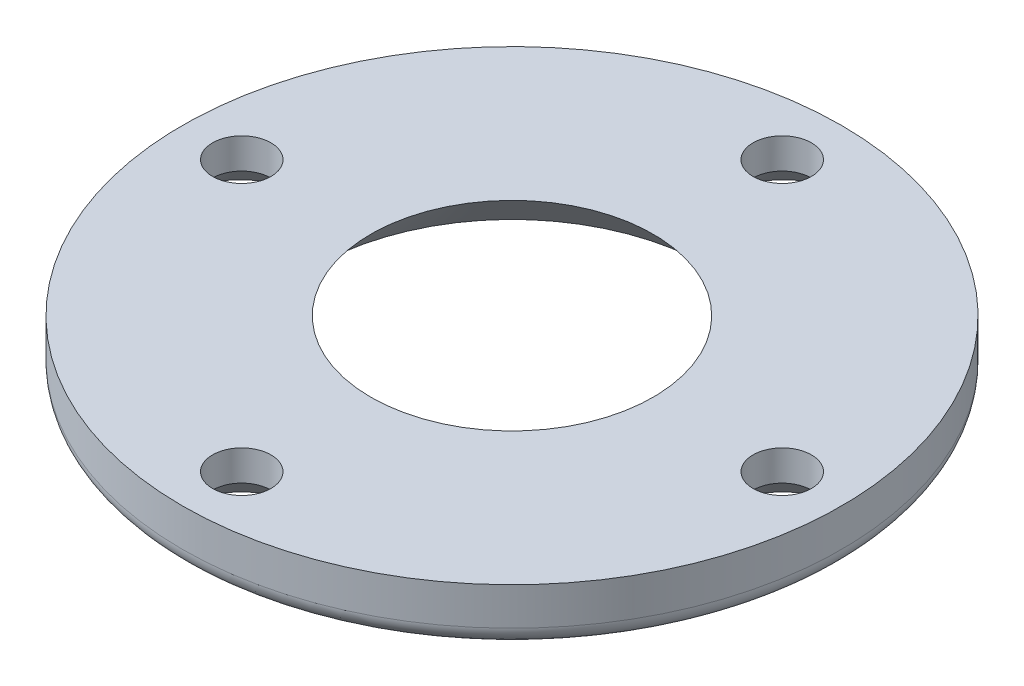
ISO-10303-21;
HEADER;
FILE_DESCRIPTION(('STEP AP214'),'2;1');
FILE_NAME('part.step','',(''),(''),'','','');
FILE_SCHEMA(('AUTOMOTIVE_DESIGN { 1 0 10303 214 1 1 1 1 }'));
ENDSEC;
DATA;
#1=APPLICATION_CONTEXT('core data for automotive mechanical design processes');
#2=APPLICATION_PROTOCOL_DEFINITION('international standard','automotive_design',2000,#1);
#3=PRODUCT_CONTEXT('',#1,'mechanical');
#4=PRODUCT('Part','Part','',(#3));
#5=PRODUCT_RELATED_PRODUCT_CATEGORY('part','',(#4));
#6=PRODUCT_DEFINITION_FORMATION('','',#4);
#7=PRODUCT_DEFINITION_CONTEXT('part definition',#1,'design');
#8=PRODUCT_DEFINITION('design','',#6,#7);
#9=PRODUCT_DEFINITION_SHAPE('','',#8);
#10=(LENGTH_UNIT() NAMED_UNIT(*) SI_UNIT(.MILLI.,.METRE.));
#11=(NAMED_UNIT(*) PLANE_ANGLE_UNIT() SI_UNIT($,.RADIAN.));
#12=(NAMED_UNIT(*) SI_UNIT($,.STERADIAN.) SOLID_ANGLE_UNIT());
#13=UNCERTAINTY_MEASURE_WITH_UNIT(LENGTH_MEASURE(1.E-05),#10,'distance_accuracy_value','');
#14=(GEOMETRIC_REPRESENTATION_CONTEXT(3) GLOBAL_UNCERTAINTY_ASSIGNED_CONTEXT((#13)) GLOBAL_UNIT_ASSIGNED_CONTEXT((#10,
#11,#12)) REPRESENTATION_CONTEXT('',''));
#15=CARTESIAN_POINT('',(0.,0.,0.));
#16=DIRECTION('',(0.,0.,1.));
#17=DIRECTION('',(1.,0.,0.));
#18=AXIS2_PLACEMENT_3D('',#15,#16,#17);
#19=CARTESIAN_POINT('',(0.,3.,0.));
#20=DIRECTION('',(0.,1.,0.));
#21=DIRECTION('',(0.,0.,1.));
#22=AXIS2_PLACEMENT_3D('',#19,#20,#21);
#23=PLANE('',#22);
#24=CARTESIAN_POINT('',(14.35,3.,0.));
#25=DIRECTION('',(0.,1.,0.));
#26=DIRECTION('',(1.,0.,0.));
#27=AXIS2_PLACEMENT_3D('',#24,#25,#26);
#28=CIRCLE('',#27,1.55);
#29=CARTESIAN_POINT('',(15.9,3.,0.));
#30=VERTEX_POINT('',#29);
#31=EDGE_CURVE('E107',#30,#30,#28,.T.);
#32=ORIENTED_EDGE('',*,*,#31,.F.);
#33=EDGE_LOOP('',(#32));
#34=FACE_BOUND('',#33,.T.);
#35=CARTESIAN_POINT('',(0.,3.,-14.35));
#36=DIRECTION('',(0.,1.,0.));
#37=DIRECTION('',(0.,0.,-1.));
#38=AXIS2_PLACEMENT_3D('',#35,#36,#37);
#39=CIRCLE('',#38,1.55);
#40=CARTESIAN_POINT('',(0.,3.,-15.9));
#41=VERTEX_POINT('',#40);
#42=EDGE_CURVE('E223',#41,#41,#39,.T.);
#43=ORIENTED_EDGE('',*,*,#42,.F.);
#44=EDGE_LOOP('',(#43));
#45=FACE_BOUND('',#44,.T.);
#46=CARTESIAN_POINT('',(-14.35,3.,1.50308271637197E-13));
#47=DIRECTION('',(0.,1.,0.));
#48=DIRECTION('',(-1.,0.,0.));
#49=AXIS2_PLACEMENT_3D('',#46,#47,#48);
#50=CIRCLE('',#49,1.55);
#51=CARTESIAN_POINT('',(-15.9,3.,1.66543659862817E-13));
#52=VERTEX_POINT('',#51);
#53=EDGE_CURVE('E231',#52,#52,#50,.T.);
#54=ORIENTED_EDGE('',*,*,#53,.F.);
#55=EDGE_LOOP('',(#54));
#56=FACE_BOUND('',#55,.T.);
#57=CARTESIAN_POINT('',(0.,3.,14.35));
#58=DIRECTION('',(0.,1.,0.));
#59=DIRECTION('',(0.,0.,1.));
#60=AXIS2_PLACEMENT_3D('',#57,#58,#59);
#61=CIRCLE('',#60,1.55);
#62=CARTESIAN_POINT('',(0.,3.,15.9));
#63=VERTEX_POINT('',#62);
#64=EDGE_CURVE('E245',#63,#63,#61,.T.);
#65=ORIENTED_EDGE('',*,*,#64,.F.);
#66=EDGE_LOOP('',(#65));
#67=FACE_BOUND('',#66,.T.);
#68=CARTESIAN_POINT('',(0.,3.,0.));
#69=DIRECTION('',(0.,1.,0.));
#70=DIRECTION('',(0.,0.,1.));
#71=AXIS2_PLACEMENT_3D('',#68,#69,#70);
#72=CIRCLE('',#71,17.5);
#73=CARTESIAN_POINT('',(0.,3.,17.5));
#74=VERTEX_POINT('',#73);
#75=EDGE_CURVE('E251',#74,#74,#72,.T.);
#76=ORIENTED_EDGE('',*,*,#75,.T.);
#77=EDGE_LOOP('',(#76));
#78=FACE_BOUND('',#77,.T.);
#79=CARTESIAN_POINT('',(0.,3.,0.));
#80=DIRECTION('',(0.,1.,0.));
#81=DIRECTION('',(0.,0.,1.));
#82=AXIS2_PLACEMENT_3D('',#79,#80,#81);
#83=CIRCLE('',#82,7.5);
#84=CARTESIAN_POINT('',(0.,3.,7.5));
#85=VERTEX_POINT('',#84);
#86=EDGE_CURVE('E196',#85,#85,#83,.T.);
#87=ORIENTED_EDGE('',*,*,#86,.F.);
#88=EDGE_LOOP('',(#87));
#89=FACE_BOUND('',#88,.T.);
#90=ADVANCED_FACE('F43',(#34,#45,#56,#67,#78,#89),#23,.T.);
#91=CARTESIAN_POINT('',(0.,0.,0.));
#92=DIRECTION('',(0.,1.,0.));
#93=DIRECTION('',(0.,0.,1.));
#94=AXIS2_PLACEMENT_3D('',#91,#92,#93);
#95=PLANE('',#94);
#96=CARTESIAN_POINT('',(0.,0.,0.));
#97=DIRECTION('',(0.,1.,0.));
#98=DIRECTION('',(0.,0.,1.));
#99=AXIS2_PLACEMENT_3D('',#96,#97,#98);
#100=CIRCLE('',#99,10.5);
#101=CARTESIAN_POINT('',(0.,0.,10.5));
#102=VERTEX_POINT('',#101);
#103=EDGE_CURVE('E199',#102,#102,#100,.T.);
#104=ORIENTED_EDGE('',*,*,#103,.T.);
#105=EDGE_LOOP('',(#104));
#106=FACE_BOUND('',#105,.T.);
#107=CARTESIAN_POINT('',(-14.35,0.,1.50308271637197E-13));
#108=DIRECTION('',(0.,1.,0.));
#109=DIRECTION('',(-1.,0.,0.));
#110=AXIS2_PLACEMENT_3D('',#107,#108,#109);
#111=CIRCLE('',#110,2.93000000000001);
#112=CARTESIAN_POINT('',(-16.3619372822299,0.,2.13002543937247));
#113=VERTEX_POINT('',#112);
#114=CARTESIAN_POINT('',(-16.36193728223,0.,-2.13002543937213));
#115=VERTEX_POINT('',#114);
#116=EDGE_CURVE('E219',#113,#115,#111,.T.);
#117=ORIENTED_EDGE('',*,*,#116,.T.);
#118=CARTESIAN_POINT('',(0.,0.,0.));
#119=DIRECTION('',(0.,1.,0.));
#120=DIRECTION('',(0.,0.,1.));
#121=AXIS2_PLACEMENT_3D('',#118,#119,#120);
#122=CIRCLE('',#121,16.5);
#123=CARTESIAN_POINT('',(-2.1300254393723,0.,-16.36193728223));
#124=VERTEX_POINT('',#123);
#125=EDGE_CURVE('E100',#115,#124,#122,.F.);
#126=ORIENTED_EDGE('',*,*,#125,.T.);
#127=CARTESIAN_POINT('',(0.,0.,-14.35));
#128=DIRECTION('',(0.,1.,0.));
#129=DIRECTION('',(0.,0.,-1.));
#130=AXIS2_PLACEMENT_3D('',#127,#128,#129);
#131=CIRCLE('',#130,2.93000000000001);
#132=CARTESIAN_POINT('',(2.1300254393723,0.,-16.36193728223));
#133=VERTEX_POINT('',#132);
#134=EDGE_CURVE('E96',#124,#133,#131,.T.);
#135=ORIENTED_EDGE('',*,*,#134,.T.);
#136=CARTESIAN_POINT('',(0.,0.,0.));
#137=DIRECTION('',(0.,1.,0.));
#138=DIRECTION('',(0.,0.,1.));
#139=AXIS2_PLACEMENT_3D('',#136,#137,#138);
#140=CIRCLE('',#139,16.5);
#141=CARTESIAN_POINT('',(16.36193728223,0.,-2.13002543937235));
#142=VERTEX_POINT('',#141);
#143=EDGE_CURVE('E89',#133,#142,#140,.F.);
#144=ORIENTED_EDGE('',*,*,#143,.T.);
#145=CARTESIAN_POINT('',(14.35,0.,0.));
#146=DIRECTION('',(0.,1.,0.));
#147=DIRECTION('',(1.,0.,0.));
#148=AXIS2_PLACEMENT_3D('',#145,#146,#147);
#149=CIRCLE('',#148,2.93000000000001);
#150=CARTESIAN_POINT('',(16.36193728223,0.,2.13002543937224));
#151=VERTEX_POINT('',#150);
#152=EDGE_CURVE('E93',#142,#151,#149,.T.);
#153=ORIENTED_EDGE('',*,*,#152,.T.);
#154=CARTESIAN_POINT('',(0.,0.,0.));
#155=DIRECTION('',(0.,1.,0.));
#156=DIRECTION('',(0.,0.,1.));
#157=AXIS2_PLACEMENT_3D('',#154,#155,#156);
#158=CIRCLE('',#157,16.5);
#159=CARTESIAN_POINT('',(2.1300254393723,0.,16.36193728223));
#160=VERTEX_POINT('',#159);
#161=EDGE_CURVE('E70',#151,#160,#158,.F.);
#162=ORIENTED_EDGE('',*,*,#161,.T.);
#163=CARTESIAN_POINT('',(0.,0.,14.35));
#164=DIRECTION('',(0.,1.,0.));
#165=DIRECTION('',(0.,0.,1.));
#166=AXIS2_PLACEMENT_3D('',#163,#164,#165);
#167=CIRCLE('',#166,2.93000000000001);
#168=CARTESIAN_POINT('',(-2.1300254393723,0.,16.36193728223));
#169=VERTEX_POINT('',#168);
#170=EDGE_CURVE('E202',#160,#169,#167,.T.);
#171=ORIENTED_EDGE('',*,*,#170,.T.);
#172=CARTESIAN_POINT('',(0.,0.,0.));
#173=DIRECTION('',(0.,1.,0.));
#174=DIRECTION('',(0.,0.,1.));
#175=AXIS2_PLACEMENT_3D('',#172,#173,#174);
#176=CIRCLE('',#175,16.5);
#177=EDGE_CURVE('E207',#169,#113,#176,.F.);
#178=ORIENTED_EDGE('',*,*,#177,.T.);
#179=EDGE_LOOP('',(#117,#126,#135,#144,#153,#162,#171,#178));
#180=FACE_BOUND('',#179,.T.);
#181=ADVANCED_FACE('F92',(#106,#180),#95,.F.);
#182=CARTESIAN_POINT('',(0.,3.,0.));
#183=DIRECTION('',(0.,-1.,0.));
#184=DIRECTION('',(0.,0.,-1.));
#185=AXIS2_PLACEMENT_3D('',#182,#183,#184);
#186=CYLINDRICAL_SURFACE('',#185,17.5);
#187=CARTESIAN_POINT('',(0.,1.,0.));
#188=DIRECTION('',(0.,1.,0.));
#189=DIRECTION('',(0.,0.,1.));
#190=AXIS2_PLACEMENT_3D('',#187,#188,#189);
#191=CIRCLE('',#190,17.5);
#192=CARTESIAN_POINT('',(0.,1.,17.5));
#193=VERTEX_POINT('',#192);
#194=EDGE_CURVE('E201',#193,#193,#191,.T.);
#195=ORIENTED_EDGE('',*,*,#194,.T.);
#196=EDGE_LOOP('',(#195));
#197=FACE_BOUND('',#196,.T.);
#198=ORIENTED_EDGE('',*,*,#75,.F.);
#199=EDGE_LOOP('',(#198));
#200=FACE_BOUND('',#199,.T.);
#201=ADVANCED_FACE('F172',(#197,#200),#186,.T.);
#202=CARTESIAN_POINT('',(0.,5.,14.35));
#203=DIRECTION('',(0.,-1.,0.));
#204=DIRECTION('',(0.,0.,-1.));
#205=AXIS2_PLACEMENT_3D('',#202,#203,#204);
#206=CYLINDRICAL_SURFACE('',#205,1.55);
#207=CARTESIAN_POINT('',(0.,1.38000000000001,14.35));
#208=DIRECTION('',(0.,1.,0.));
#209=DIRECTION('',(0.,0.,1.));
#210=AXIS2_PLACEMENT_3D('',#207,#208,#209);
#211=CIRCLE('',#210,1.55);
#212=CARTESIAN_POINT('',(0.,1.38000000000001,15.9));
#213=VERTEX_POINT('',#212);
#214=EDGE_CURVE('E209',#213,#213,#211,.F.);
#215=ORIENTED_EDGE('',*,*,#214,.T.);
#216=EDGE_LOOP('',(#215));
#217=FACE_BOUND('',#216,.T.);
#218=ORIENTED_EDGE('',*,*,#64,.T.);
#219=EDGE_LOOP('',(#218));
#220=FACE_BOUND('',#219,.T.);
#221=ADVANCED_FACE('F169',(#217,#220),#206,.F.);
#222=CARTESIAN_POINT('',(0.,1.38000000000001,14.35));
#223=DIRECTION('',(0.,-1.,0.));
#224=DIRECTION('',(0.,0.,-1.));
#225=AXIS2_PLACEMENT_3D('',#222,#223,#224);
#226=CONICAL_SURFACE('',#225,1.55,0.78539816339745);
#227=ORIENTED_EDGE('',*,*,#170,.F.);
#228=CARTESIAN_POINT('',(2.1300254393723,0.,16.36193728223));
#229=CARTESIAN_POINT('',(2.1006708283794,2.87344197871028E-05,16.3929769351358));
#230=CARTESIAN_POINT('',(2.06992853132094,0.00109203714756216,16.4226111832569));
#231=CARTESIAN_POINT('',(2.00627791638471,0.0047953488135179,16.4791950390313));
#232=CARTESIAN_POINT('',(1.97337515772412,0.00743144206675659,16.506151120588));
#233=CARTESIAN_POINT('',(1.90614087715797,0.0137666222520169,16.5574441243659));
#234=CARTESIAN_POINT('',(1.87182339585444,0.0174567522889738,16.5818008352366));
#235=CARTESIAN_POINT('',(1.80180100066957,0.0255896325122809,16.6283469623081));
#236=CARTESIAN_POINT('',(1.76609492495749,0.0300330238635597,16.6505345065646));
#237=CARTESIAN_POINT('',(1.66388391412313,0.0432395966692672,16.7102192140959));
#238=CARTESIAN_POINT('',(1.59608576823537,0.0525622825613292,16.7453869949139));
#239=CARTESIAN_POINT('',(1.45781087464647,0.0716600385954067,16.8098020724105));
#240=CARTESIAN_POINT('',(1.38733305901709,0.0814352894430963,16.8390469786406));
#241=CARTESIAN_POINT('',(1.24389611421334,0.100688432759219,16.89234569789));
#242=CARTESIAN_POINT('',(1.17092413082206,0.110164058816863,16.9163655792347));
#243=CARTESIAN_POINT('',(1.02339609716383,0.12812292173962,16.9594064415519));
#244=CARTESIAN_POINT('',(0.948839677057427,0.136605923832015,16.9784262412395));
#245=CARTESIAN_POINT('',(0.773231923526417,0.15468460008705,17.0173887504663));
#246=CARTESIAN_POINT('',(0.671706980535431,0.163694189924857,17.0354884960832));
#247=CARTESIAN_POINT('',(0.46730130784447,0.178180276083924,17.0638049325641));
#248=CARTESIAN_POINT('',(0.364420235197101,0.183655860505297,17.0740195889259));
#249=CARTESIAN_POINT('',(0.157982152439849,0.190567989029399,17.0868261074681));
#250=CARTESIAN_POINT('',(0.0544247510865972,0.192001940077398,17.0894130758809));
#251=CARTESIAN_POINT('',(-0.152564695846987,0.190690282602337,17.0870154170996));
#252=CARTESIAN_POINT('',(-0.255996753235584,0.187945104368294,17.0820315694073));
#253=CARTESIAN_POINT('',(-0.46273471253689,0.178497165450119,17.06430684722));
#254=CARTESIAN_POINT('',(-0.566034817600031,0.171767223158434,17.0515126767402));
#255=CARTESIAN_POINT('',(-0.7710529334461,0.154961181941926,17.0177787932982));
#256=CARTESIAN_POINT('',(-0.872770596425065,0.144884357988207,16.9968373152311));
#257=CARTESIAN_POINT('',(-1.07301918575195,0.122469412736061,16.9464054273482));
#258=CARTESIAN_POINT('',(-1.1715679654881,0.110148351116242,16.9169785966402));
#259=CARTESIAN_POINT('',(-1.36522328561087,0.0845547845174734,16.8486189706979));
#260=CARTESIAN_POINT('',(-1.46033103929434,0.0712826199133519,16.8096895643034));
#261=CARTESIAN_POINT('',(-1.60562955309491,0.0512671648943903,16.7400673983246));
#262=CARTESIAN_POINT('',(-1.65753547036073,0.0441723003457841,16.7130403204377));
#263=CARTESIAN_POINT('',(-1.75918854910513,0.030853120453895,16.6551421806775));
#264=CARTESIAN_POINT('',(-1.80893886520717,0.0246275011366057,16.6242770108368));
#265=CARTESIAN_POINT('',(-1.90623636370717,0.0136651411204997,16.5578820536807));
#266=CARTESIAN_POINT('',(-1.95375484760579,0.00894476021436981,16.5223065911224));
#267=CARTESIAN_POINT('',(-2.02221778418615,0.0038255350261,16.4651875384309));
#268=CARTESIAN_POINT('',(-2.0446173949931,0.00244512815133739,16.4454726780044));
#269=CARTESIAN_POINT('',(-2.08825300457404,0.000535244805964703,16.4047154111002));
#270=CARTESIAN_POINT('',(-2.10948775652668,6.66356912813178E-06,16.383671632081));
#271=CARTESIAN_POINT('',(-2.1300254393723,0.,16.36193728223));
#272=B_SPLINE_CURVE_WITH_KNOTS('',3,(#228,#229,#230,#231,#232,#233,#234,#235,#236,#237,#238,
#239,#240,#241,#242,#243,#244,#245,#246,#247,#248,#249,#250,#251,#252,#253,#254,#255,#256,#257,
#258,#259,#260,#261,#262,#263,#264,#265,#266,#267,#268,#269,#270,#271),.UNSPECIFIED.,.F.,.F.,(4,
2,2,2,2,2,2,2,2,2,2,2,2,2,2,2,2,2,2,2,2,4),(0.,0.128010954254938,0.255704529236439,
0.382343734611422,0.50909127967798,0.739557147685854,0.97011584624908,1.20212984532732,
1.4341986092784,1.74435594045875,2.05459327136876,2.36502960089726,2.67543396962724,
2.98798052339353,3.30059482775999,3.61092507296435,3.92114480845388,4.09785469358765,
4.2742965768036,4.4525954779855,4.54215366220222,4.63180590715633),.UNSPECIFIED.);
#273=EDGE_CURVE('E58',#160,#169,#272,.T.);
#274=ORIENTED_EDGE('',*,*,#273,.T.);
#275=EDGE_LOOP('',(#227,#274));
#276=FACE_BOUND('',#275,.T.);
#277=ORIENTED_EDGE('',*,*,#214,.F.);
#278=EDGE_LOOP('',(#277));
#279=FACE_BOUND('',#278,.T.);
#280=ADVANCED_FACE('F167',(#276,#279),#226,.F.);
#281=CARTESIAN_POINT('',(-14.35,5.,1.50308271637197E-13));
#282=DIRECTION('',(0.,-1.,0.));
#283=DIRECTION('',(1.,0.,0.));
#284=AXIS2_PLACEMENT_3D('',#281,#282,#283);
#285=CYLINDRICAL_SURFACE('',#284,1.55);
#286=CARTESIAN_POINT('',(-14.35,1.38000000000001,1.50308271637197E-13));
#287=DIRECTION('',(0.,1.,0.));
#288=DIRECTION('',(-1.,0.,0.));
#289=AXIS2_PLACEMENT_3D('',#286,#287,#288);
#290=CIRCLE('',#289,1.55);
#291=CARTESIAN_POINT('',(-15.9,1.38000000000001,1.66543659862817E-13));
#292=VERTEX_POINT('',#291);
#293=EDGE_CURVE('E224',#292,#292,#290,.F.);
#294=ORIENTED_EDGE('',*,*,#293,.T.);
#295=EDGE_LOOP('',(#294));
#296=FACE_BOUND('',#295,.T.);
#297=ORIENTED_EDGE('',*,*,#53,.T.);
#298=EDGE_LOOP('',(#297));
#299=FACE_BOUND('',#298,.T.);
#300=ADVANCED_FACE('F163',(#296,#299),#285,.F.);
#301=CARTESIAN_POINT('',(-14.35,1.38000000000001,1.50308271637197E-13));
#302=DIRECTION('',(0.,-1.,0.));
#303=DIRECTION('',(1.,0.,0.));
#304=AXIS2_PLACEMENT_3D('',#301,#302,#303);
#305=CONICAL_SURFACE('',#304,1.55,0.78539816339745);
#306=ORIENTED_EDGE('',*,*,#116,.F.);
#307=CARTESIAN_POINT('',(-16.3619372822299,0.,2.13002543937247));
#308=CARTESIAN_POINT('',(-16.3929769351358,2.87344197873833E-05,2.10067082837957));
#309=CARTESIAN_POINT('',(-16.4226111832569,0.00109203714756233,2.06992853132111));
#310=CARTESIAN_POINT('',(-16.4791950390313,0.00479534881351779,2.00627791638488));
#311=CARTESIAN_POINT('',(-16.506151120588,0.00743144206675633,1.97337515772429));
#312=CARTESIAN_POINT('',(-16.5574441243659,0.0137666222520168,1.90614087715814));
#313=CARTESIAN_POINT('',(-16.5818008352366,0.017456752288974,1.87182339585462));
#314=CARTESIAN_POINT('',(-16.628346962308,0.0255896325122814,1.80180100066974));
#315=CARTESIAN_POINT('',(-16.6505345065646,0.0300330238635604,1.76609492495767));
#316=CARTESIAN_POINT('',(-16.7102192140959,0.0432395966692682,1.6638839141233));
#317=CARTESIAN_POINT('',(-16.7453869949139,0.0525622825613302,1.59608576823555));
#318=CARTESIAN_POINT('',(-16.8098020724105,0.0716600385954073,1.45781087464664));
#319=CARTESIAN_POINT('',(-16.8390469786406,0.0814352894430965,1.38733305901726));
#320=CARTESIAN_POINT('',(-16.89234569789,0.100688432759219,1.24389611421352));
#321=CARTESIAN_POINT('',(-16.9163655792346,0.110164058816864,1.17092413082224));
#322=CARTESIAN_POINT('',(-16.9594064415519,0.12812292173962,1.023396097164));
#323=CARTESIAN_POINT('',(-16.9784262412395,0.136605923832014,0.948839677057603));
#324=CARTESIAN_POINT('',(-17.0173887504663,0.154684600087048,0.773231923526594));
#325=CARTESIAN_POINT('',(-17.0354884960832,0.163694189924857,0.671706980535608));
#326=CARTESIAN_POINT('',(-17.0638049325641,0.178180276083925,0.467301307844648));
#327=CARTESIAN_POINT('',(-17.0740195889259,0.183655860505297,0.364420235197278));
#328=CARTESIAN_POINT('',(-17.0868261074681,0.190567989029397,0.157982152440026));
#329=CARTESIAN_POINT('',(-17.0894130758809,0.192001940077396,0.0544247510867744));
#330=CARTESIAN_POINT('',(-17.0870154170996,0.190690282602336,-0.15256469584681));
#331=CARTESIAN_POINT('',(-17.0820315694073,0.187945104368294,-0.255996753235407));
#332=CARTESIAN_POINT('',(-17.06430684722,0.178497165450119,-0.462734712536713));
#333=CARTESIAN_POINT('',(-17.0515126767402,0.171767223158435,-0.566034817599854));
#334=CARTESIAN_POINT('',(-17.0177787932982,0.154961181941926,-0.771052933445923));
#335=CARTESIAN_POINT('',(-16.9968373152311,0.144884357988207,-0.872770596424888));
#336=CARTESIAN_POINT('',(-16.9464054273482,0.122469412736061,-1.07301918575178));
#337=CARTESIAN_POINT('',(-16.9169785966402,0.110148351116242,-1.17156796548793));
#338=CARTESIAN_POINT('',(-16.848618970698,0.084554784517473,-1.3652232856107));
#339=CARTESIAN_POINT('',(-16.8096895643034,0.0712826199133513,-1.46033103929416));
#340=CARTESIAN_POINT('',(-16.7400673983246,0.05126716489439,-1.60562955309474));
#341=CARTESIAN_POINT('',(-16.7130403204377,0.0441723003457841,-1.65753547036056));
#342=CARTESIAN_POINT('',(-16.6551421806775,0.0308531204538952,-1.75918854910495));
#343=CARTESIAN_POINT('',(-16.6242770108368,0.0246275011366059,-1.80893886520699));
#344=CARTESIAN_POINT('',(-16.5578820536807,0.0136651411204999,-1.906236363707));
#345=CARTESIAN_POINT('',(-16.5223065911224,0.00894476021437008,-1.95375484760561));
#346=CARTESIAN_POINT('',(-16.4651875384309,0.00382553502610008,-2.02221778418598));
#347=CARTESIAN_POINT('',(-16.4454726780044,0.00244512815133737,-2.04461739499293));
#348=CARTESIAN_POINT('',(-16.4047154111003,0.000535244805964524,-2.08825300457386));
#349=CARTESIAN_POINT('',(-16.383671632081,6.6635691279316E-06,-2.10948775652651));
#350=CARTESIAN_POINT('',(-16.36193728223,0.,-2.13002543937213));
#351=B_SPLINE_CURVE_WITH_KNOTS('',3,(#307,#308,#309,#310,#311,#312,#313,#314,#315,#316,#317,
#318,#319,#320,#321,#322,#323,#324,#325,#326,#327,#328,#329,#330,#331,#332,#333,#334,#335,#336,
#337,#338,#339,#340,#341,#342,#343,#344,#345,#346,#347,#348,#349,#350),.UNSPECIFIED.,.F.,.F.,(4,
2,2,2,2,2,2,2,2,2,2,2,2,2,2,2,2,2,2,2,2,4),(0.,0.128010954254938,0.255704529236441,
0.382343734611423,0.50909127967798,0.739557147685856,0.970115846249081,1.20212984532732,
1.4341986092784,1.74435594045876,2.05459327136876,2.36502960089726,2.67543396962724,
2.98798052339354,3.30059482775999,3.61092507296436,3.92114480845388,4.09785469358765,
4.2742965768036,4.4525954779855,4.54215366220222,4.63180590715633),.UNSPECIFIED.);
#352=EDGE_CURVE('E11',#113,#115,#351,.T.);
#353=ORIENTED_EDGE('',*,*,#352,.T.);
#354=EDGE_LOOP('',(#306,#353));
#355=FACE_BOUND('',#354,.T.);
#356=ORIENTED_EDGE('',*,*,#293,.F.);
#357=EDGE_LOOP('',(#356));
#358=FACE_BOUND('',#357,.T.);
#359=ADVANCED_FACE('F155',(#355,#358),#305,.F.);
#360=CARTESIAN_POINT('',(0.,5.,-14.35));
#361=DIRECTION('',(0.,-1.,0.));
#362=DIRECTION('',(0.,0.,1.));
#363=AXIS2_PLACEMENT_3D('',#360,#361,#362);
#364=CYLINDRICAL_SURFACE('',#363,1.55);
#365=CARTESIAN_POINT('',(0.,1.38000000000001,-14.35));
#366=DIRECTION('',(0.,1.,0.));
#367=DIRECTION('',(0.,0.,-1.));
#368=AXIS2_PLACEMENT_3D('',#365,#366,#367);
#369=CIRCLE('',#368,1.55);
#370=CARTESIAN_POINT('',(0.,1.38000000000001,-15.9));
#371=VERTEX_POINT('',#370);
#372=EDGE_CURVE('E108',#371,#371,#369,.F.);
#373=ORIENTED_EDGE('',*,*,#372,.T.);
#374=EDGE_LOOP('',(#373));
#375=FACE_BOUND('',#374,.T.);
#376=ORIENTED_EDGE('',*,*,#42,.T.);
#377=EDGE_LOOP('',(#376));
#378=FACE_BOUND('',#377,.T.);
#379=ADVANCED_FACE('F152',(#375,#378),#364,.F.);
#380=CARTESIAN_POINT('',(0.,1.38000000000001,-14.35));
#381=DIRECTION('',(0.,-1.,0.));
#382=DIRECTION('',(0.,0.,1.));
#383=AXIS2_PLACEMENT_3D('',#380,#381,#382);
#384=CONICAL_SURFACE('',#383,1.55,0.78539816339745);
#385=ORIENTED_EDGE('',*,*,#134,.F.);
#386=CARTESIAN_POINT('',(-2.1300254393723,0.,-16.36193728223));
#387=CARTESIAN_POINT('',(-2.1006708283794,2.87344197871028E-05,-16.3929769351358));
#388=CARTESIAN_POINT('',(-2.06992853132094,0.00109203714756216,-16.4226111832569));
#389=CARTESIAN_POINT('',(-2.00627791638471,0.0047953488135179,-16.4791950390313));
#390=CARTESIAN_POINT('',(-1.97337515772412,0.00743144206675659,-16.506151120588));
#391=CARTESIAN_POINT('',(-1.90614087715797,0.0137666222520169,-16.5574441243659));
#392=CARTESIAN_POINT('',(-1.87182339585444,0.0174567522889738,-16.5818008352366));
#393=CARTESIAN_POINT('',(-1.80180100066957,0.0255896325122809,-16.6283469623081));
#394=CARTESIAN_POINT('',(-1.76609492495749,0.0300330238635597,-16.6505345065646));
#395=CARTESIAN_POINT('',(-1.66388391412313,0.0432395966692672,-16.7102192140959));
#396=CARTESIAN_POINT('',(-1.59608576823537,0.0525622825613292,-16.7453869949139));
#397=CARTESIAN_POINT('',(-1.45781087464647,0.0716600385954067,-16.8098020724105));
#398=CARTESIAN_POINT('',(-1.38733305901709,0.0814352894430963,-16.8390469786406));
#399=CARTESIAN_POINT('',(-1.24389611421334,0.100688432759219,-16.89234569789));
#400=CARTESIAN_POINT('',(-1.17092413082206,0.110164058816863,-16.9163655792347));
#401=CARTESIAN_POINT('',(-1.02339609716383,0.12812292173962,-16.9594064415519));
#402=CARTESIAN_POINT('',(-0.948839677057427,0.136605923832015,-16.9784262412395));
#403=CARTESIAN_POINT('',(-0.773231923526417,0.15468460008705,-17.0173887504663));
#404=CARTESIAN_POINT('',(-0.671706980535431,0.163694189924857,-17.0354884960832));
#405=CARTESIAN_POINT('',(-0.46730130784447,0.178180276083924,-17.0638049325641));
#406=CARTESIAN_POINT('',(-0.364420235197101,0.183655860505297,-17.0740195889259));
#407=CARTESIAN_POINT('',(-0.157982152439849,0.190567989029399,-17.0868261074681));
#408=CARTESIAN_POINT('',(-0.0544247510865972,0.192001940077398,-17.0894130758809));
#409=CARTESIAN_POINT('',(0.152564695846987,0.190690282602337,-17.0870154170996));
#410=CARTESIAN_POINT('',(0.255996753235584,0.187945104368294,-17.0820315694073));
#411=CARTESIAN_POINT('',(0.46273471253689,0.178497165450119,-17.06430684722));
#412=CARTESIAN_POINT('',(0.566034817600031,0.171767223158434,-17.0515126767402));
#413=CARTESIAN_POINT('',(0.7710529334461,0.154961181941926,-17.0177787932982));
#414=CARTESIAN_POINT('',(0.872770596425065,0.144884357988207,-16.9968373152311));
#415=CARTESIAN_POINT('',(1.07301918575195,0.122469412736061,-16.9464054273482));
#416=CARTESIAN_POINT('',(1.1715679654881,0.110148351116242,-16.9169785966402));
#417=CARTESIAN_POINT('',(1.36522328561087,0.0845547845174734,-16.8486189706979));
#418=CARTESIAN_POINT('',(1.46033103929434,0.0712826199133519,-16.8096895643034));
#419=CARTESIAN_POINT('',(1.60562955309491,0.0512671648943903,-16.7400673983246));
#420=CARTESIAN_POINT('',(1.65753547036073,0.0441723003457841,-16.7130403204377));
#421=CARTESIAN_POINT('',(1.75918854910513,0.030853120453895,-16.6551421806775));
#422=CARTESIAN_POINT('',(1.80893886520717,0.0246275011366057,-16.6242770108368));
#423=CARTESIAN_POINT('',(1.90623636370717,0.0136651411204997,-16.5578820536807));
#424=CARTESIAN_POINT('',(1.95375484760579,0.00894476021436981,-16.5223065911224));
#425=CARTESIAN_POINT('',(2.02221778418615,0.0038255350261,-16.4651875384309));
#426=CARTESIAN_POINT('',(2.0446173949931,0.00244512815133739,-16.4454726780044));
#427=CARTESIAN_POINT('',(2.08825300457404,0.000535244805964703,-16.4047154111002));
#428=CARTESIAN_POINT('',(2.10948775652668,6.66356912813178E-06,-16.383671632081));
#429=CARTESIAN_POINT('',(2.1300254393723,0.,-16.36193728223));
#430=B_SPLINE_CURVE_WITH_KNOTS('',3,(#386,#387,#388,#389,#390,#391,#392,#393,#394,#395,#396,
#397,#398,#399,#400,#401,#402,#403,#404,#405,#406,#407,#408,#409,#410,#411,#412,#413,#414,#415,
#416,#417,#418,#419,#420,#421,#422,#423,#424,#425,#426,#427,#428,#429),.UNSPECIFIED.,.F.,.F.,(4,
2,2,2,2,2,2,2,2,2,2,2,2,2,2,2,2,2,2,2,2,4),(0.,0.128010954254938,0.255704529236439,
0.382343734611422,0.50909127967798,0.739557147685854,0.97011584624908,1.20212984532732,
1.4341986092784,1.74435594045875,2.05459327136876,2.36502960089726,2.67543396962724,
2.98798052339353,3.30059482775999,3.61092507296435,3.92114480845388,4.09785469358765,
4.2742965768036,4.4525954779855,4.54215366220222,4.63180590715633),.UNSPECIFIED.);
#431=EDGE_CURVE('E112',#124,#133,#430,.T.);
#432=ORIENTED_EDGE('',*,*,#431,.T.);
#433=EDGE_LOOP('',(#385,#432));
#434=FACE_BOUND('',#433,.T.);
#435=ORIENTED_EDGE('',*,*,#372,.F.);
#436=EDGE_LOOP('',(#435));
#437=FACE_BOUND('',#436,.T.);
#438=ADVANCED_FACE('F144',(#434,#437),#384,.F.);
#439=CARTESIAN_POINT('',(14.35,5.,0.));
#440=DIRECTION('',(0.,-1.,0.));
#441=DIRECTION('',(-1.,0.,0.));
#442=AXIS2_PLACEMENT_3D('',#439,#440,#441);
#443=CYLINDRICAL_SURFACE('',#442,1.55);
#444=CARTESIAN_POINT('',(14.35,1.38000000000001,0.));
#445=DIRECTION('',(0.,1.,0.));
#446=DIRECTION('',(1.,0.,0.));
#447=AXIS2_PLACEMENT_3D('',#444,#445,#446);
#448=CIRCLE('',#447,1.55);
#449=CARTESIAN_POINT('',(15.9,1.38000000000001,0.));
#450=VERTEX_POINT('',#449);
#451=EDGE_CURVE('E234',#450,#450,#448,.F.);
#452=ORIENTED_EDGE('',*,*,#451,.T.);
#453=EDGE_LOOP('',(#452));
#454=FACE_BOUND('',#453,.T.);
#455=ORIENTED_EDGE('',*,*,#31,.T.);
#456=EDGE_LOOP('',(#455));
#457=FACE_BOUND('',#456,.T.);
#458=ADVANCED_FACE('F142',(#454,#457),#443,.F.);
#459=CARTESIAN_POINT('',(14.35,1.38000000000001,0.));
#460=DIRECTION('',(0.,-1.,0.));
#461=DIRECTION('',(-1.,0.,0.));
#462=AXIS2_PLACEMENT_3D('',#459,#460,#461);
#463=CONICAL_SURFACE('',#462,1.55,0.78539816339745);
#464=ORIENTED_EDGE('',*,*,#152,.F.);
#465=CARTESIAN_POINT('',(16.36193728223,0.,-2.13002543937235));
#466=CARTESIAN_POINT('',(16.3929769351358,2.87344197875878E-05,-2.10067082837946));
#467=CARTESIAN_POINT('',(16.4226111832569,0.00109203714756256,-2.06992853132099));
#468=CARTESIAN_POINT('',(16.4791950390313,0.00479534881351795,-2.00627791638477));
#469=CARTESIAN_POINT('',(16.506151120588,0.00743144206675641,-1.97337515772418));
#470=CARTESIAN_POINT('',(16.5574441243659,0.0137666222520169,-1.90614087715802));
#471=CARTESIAN_POINT('',(16.5818008352366,0.0174567522889742,-1.8718233958545));
#472=CARTESIAN_POINT('',(16.6283469623081,0.0255896325122816,-1.80180100066962));
#473=CARTESIAN_POINT('',(16.6505345065646,0.0300330238635603,-1.76609492495755));
#474=CARTESIAN_POINT('',(16.7102192140959,0.043239596669268,-1.66388391412318));
#475=CARTESIAN_POINT('',(16.7453869949139,0.0525622825613306,-1.59608576823543));
#476=CARTESIAN_POINT('',(16.8098020724105,0.0716600385954083,-1.45781087464652));
#477=CARTESIAN_POINT('',(16.8390469786406,0.0814352894430974,-1.38733305901714));
#478=CARTESIAN_POINT('',(16.89234569789,0.10068843275922,-1.24389611421339));
#479=CARTESIAN_POINT('',(16.9163655792347,0.110164058816864,-1.17092413082211));
#480=CARTESIAN_POINT('',(16.9594064415519,0.128122921739622,-1.02339609716387));
#481=CARTESIAN_POINT('',(16.9784262412395,0.136605923832016,-0.94883967705747));
#482=CARTESIAN_POINT('',(17.0173887504663,0.15468460008705,-0.773231923526459));
#483=CARTESIAN_POINT('',(17.0354884960832,0.163694189924858,-0.671706980535473));
#484=CARTESIAN_POINT('',(17.0638049325641,0.178180276083924,-0.467301307844512));
#485=CARTESIAN_POINT('',(17.0740195889259,0.183655860505297,-0.364420235197143));
#486=CARTESIAN_POINT('',(17.0868261074681,0.190567989029398,-0.15798215243989));
#487=CARTESIAN_POINT('',(17.0894130758809,0.192001940077398,-0.0544247510866383));
#488=CARTESIAN_POINT('',(17.0870154170996,0.190690282602337,0.152564695846946));
#489=CARTESIAN_POINT('',(17.0820315694073,0.187945104368294,0.255996753235543));
#490=CARTESIAN_POINT('',(17.06430684722,0.178497165450118,0.462734712536849));
#491=CARTESIAN_POINT('',(17.0515126767402,0.171767223158433,0.566034817599991));
#492=CARTESIAN_POINT('',(17.0177787932982,0.154961181941923,0.77105293344606));
#493=CARTESIAN_POINT('',(16.9968373152311,0.144884357988204,0.872770596425023));
#494=CARTESIAN_POINT('',(16.9464054273482,0.122469412736058,1.07301918575191));
#495=CARTESIAN_POINT('',(16.9169785966402,0.110148351116239,1.17156796548807));
#496=CARTESIAN_POINT('',(16.8486189706979,0.0845547845174707,1.36522328561083));
#497=CARTESIAN_POINT('',(16.8096895643034,0.0712826199133498,1.46033103929429));
#498=CARTESIAN_POINT('',(16.7400673983246,0.0512671648943881,1.60562955309487));
#499=CARTESIAN_POINT('',(16.7130403204377,0.0441723003457817,1.65753547036069));
#500=CARTESIAN_POINT('',(16.6551421806775,0.0308531204538933,1.75918854910508));
#501=CARTESIAN_POINT('',(16.6242770108368,0.0246275011366048,1.80893886520712));
#502=CARTESIAN_POINT('',(16.5578820536807,0.0136651411204997,1.90623636370712));
#503=CARTESIAN_POINT('',(16.5223065911224,0.00894476021436981,1.95375484760573));
#504=CARTESIAN_POINT('',(16.4651875384309,0.0038255350260999,2.0222177841861));
#505=CARTESIAN_POINT('',(16.4454726780044,0.00244512815133723,2.04461739499304));
#506=CARTESIAN_POINT('',(16.4047154111002,0.000535244805964487,2.08825300457398));
#507=CARTESIAN_POINT('',(16.383671632081,6.66356912794088E-06,2.10948775652662));
#508=CARTESIAN_POINT('',(16.36193728223,0.,2.13002543937224));
#509=B_SPLINE_CURVE_WITH_KNOTS('',3,(#465,#466,#467,#468,#469,#470,#471,#472,#473,#474,#475,
#476,#477,#478,#479,#480,#481,#482,#483,#484,#485,#486,#487,#488,#489,#490,#491,#492,#493,#494,
#495,#496,#497,#498,#499,#500,#501,#502,#503,#504,#505,#506,#507,#508),.UNSPECIFIED.,.F.,.F.,(4,
2,2,2,2,2,2,2,2,2,2,2,2,2,2,2,2,2,2,2,2,4),(0.,0.128010954254938,0.255704529236442,
0.382343734611426,0.509091279677983,0.739557147685862,0.970115846249089,1.20212984532733,
1.43419860927842,1.74435594045877,2.05459327136878,2.36502960089728,2.67543396962726,
2.98798052339355,3.30059482776001,3.61092507296438,3.9211448084539,4.09785469358766,
4.27429657680361,4.4525954779855,4.54215366220222,4.63180590715633),.UNSPECIFIED.);
#510=EDGE_CURVE('E105',#142,#151,#509,.T.);
#511=ORIENTED_EDGE('',*,*,#510,.T.);
#512=EDGE_LOOP('',(#464,#511));
#513=FACE_BOUND('',#512,.T.);
#514=ORIENTED_EDGE('',*,*,#451,.F.);
#515=EDGE_LOOP('',(#514));
#516=FACE_BOUND('',#515,.T.);
#517=ADVANCED_FACE('F103',(#513,#516),#463,.F.);
#518=CARTESIAN_POINT('',(0.,0.,0.));
#519=DIRECTION('',(0.,-1.,0.));
#520=DIRECTION('',(0.,0.,-1.));
#521=AXIS2_PLACEMENT_3D('',#518,#519,#520);
#522=CONICAL_SURFACE('',#521,10.5,0.785398163397446);
#523=ORIENTED_EDGE('',*,*,#86,.T.);
#524=EDGE_LOOP('',(#523));
#525=FACE_BOUND('',#524,.T.);
#526=ORIENTED_EDGE('',*,*,#103,.F.);
#527=EDGE_LOOP('',(#526));
#528=FACE_BOUND('',#527,.T.);
#529=ADVANCED_FACE('F141',(#525,#528),#522,.F.);
#530=CARTESIAN_POINT('',(0.,1.,0.));
#531=DIRECTION('',(0.,1.,0.));
#532=DIRECTION('',(0.,0.,1.));
#533=AXIS2_PLACEMENT_3D('',#530,#531,#532);
#534=TOROIDAL_SURFACE('',#533,16.5,1.);
#535=ORIENTED_EDGE('',*,*,#431,.F.);
#536=ORIENTED_EDGE('',*,*,#125,.F.);
#537=ORIENTED_EDGE('',*,*,#352,.F.);
#538=ORIENTED_EDGE('',*,*,#177,.F.);
#539=ORIENTED_EDGE('',*,*,#273,.F.);
#540=ORIENTED_EDGE('',*,*,#161,.F.);
#541=ORIENTED_EDGE('',*,*,#510,.F.);
#542=ORIENTED_EDGE('',*,*,#143,.F.);
#543=EDGE_LOOP('',(#535,#536,#537,#538,#539,#540,#541,#542));
#544=FACE_BOUND('',#543,.T.);
#545=ORIENTED_EDGE('',*,*,#194,.F.);
#546=EDGE_LOOP('',(#545));
#547=FACE_BOUND('',#546,.T.);
#548=ADVANCED_FACE('F45',(#544,#547),#534,.T.);
#549=CLOSED_SHELL('',(#90,#181,#201,#221,#280,#300,#359,#379,#438,#458,#517,#529,#548));
#550=MANIFOLD_SOLID_BREP('B2',#549);
#551=ADVANCED_BREP_SHAPE_REPRESENTATION('',(#18,#550),#14);
#552=SHAPE_DEFINITION_REPRESENTATION(#9,#551);
ENDSEC;
END-ISO-10303-21;
